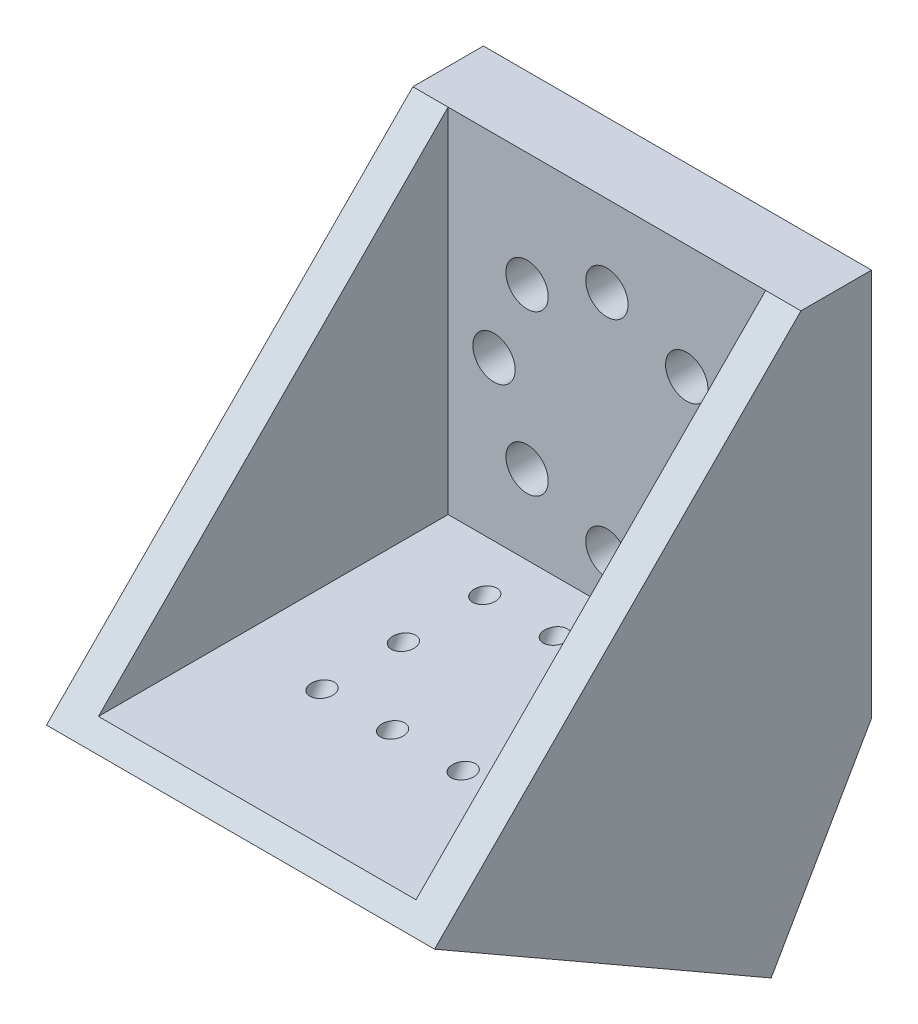
ISO-10303-21;
HEADER;
FILE_DESCRIPTION(('STEP AP214'),'2;1');
FILE_NAME('part.step','',(''),(''),'','','');
FILE_SCHEMA(('AUTOMOTIVE_DESIGN { 1 0 10303 214 1 1 1 1 }'));
ENDSEC;
DATA;
#1=APPLICATION_CONTEXT('core data for automotive mechanical design processes');
#2=APPLICATION_PROTOCOL_DEFINITION('international standard','automotive_design',2000,#1);
#3=PRODUCT_CONTEXT('',#1,'mechanical');
#4=PRODUCT('Part','Part','',(#3));
#5=PRODUCT_RELATED_PRODUCT_CATEGORY('part','',(#4));
#6=PRODUCT_DEFINITION_FORMATION('','',#4);
#7=PRODUCT_DEFINITION_CONTEXT('part definition',#1,'design');
#8=PRODUCT_DEFINITION('design','',#6,#7);
#9=PRODUCT_DEFINITION_SHAPE('','',#8);
#10=(LENGTH_UNIT() NAMED_UNIT(*) SI_UNIT(.MILLI.,.METRE.));
#11=(NAMED_UNIT(*) PLANE_ANGLE_UNIT() SI_UNIT($,.RADIAN.));
#12=(NAMED_UNIT(*) SI_UNIT($,.STERADIAN.) SOLID_ANGLE_UNIT());
#13=UNCERTAINTY_MEASURE_WITH_UNIT(LENGTH_MEASURE(1.E-05),#10,'distance_accuracy_value','');
#14=(GEOMETRIC_REPRESENTATION_CONTEXT(3) GLOBAL_UNCERTAINTY_ASSIGNED_CONTEXT((#13)) GLOBAL_UNIT_ASSIGNED_CONTEXT((#10,
#11,#12)) REPRESENTATION_CONTEXT('',''));
#15=CARTESIAN_POINT('',(0.,0.,0.));
#16=DIRECTION('',(0.,0.,1.));
#17=DIRECTION('',(1.,0.,0.));
#18=AXIS2_PLACEMENT_3D('',#15,#16,#17);
#19=CARTESIAN_POINT('',(-27.5,-27.5,10.));
#20=DIRECTION('',(1.,0.,0.));
#21=DIRECTION('',(0.,0.,-1.));
#22=AXIS2_PLACEMENT_3D('',#19,#20,#21);
#23=PLANE('',#22);
#24=DIRECTION('',(0.,-1.,0.));
#25=VECTOR('',#24,1.);
#26=CARTESIAN_POINT('',(-27.5,-27.5,0.));
#27=LINE('',#26,#25);
#28=CARTESIAN_POINT('',(-27.5,27.5,0.));
#29=VERTEX_POINT('',#28);
#30=CARTESIAN_POINT('',(-27.5,-27.5,0.));
#31=VERTEX_POINT('',#30);
#32=EDGE_CURVE('E89',#29,#31,#27,.T.);
#33=ORIENTED_EDGE('',*,*,#32,.T.);
#34=DIRECTION('',(0.,0.867244547743442,-0.497882410222808));
#35=VECTOR('',#34,1.);
#36=CARTESIAN_POINT('',(-27.5,-27.5,0.));
#37=LINE('',#36,#35);
#38=CARTESIAN_POINT('',(-27.5,-52.2691450902398,14.2198895210988));
#39=VERTEX_POINT('',#38);
#40=EDGE_CURVE('E176',#39,#31,#37,.T.);
#41=ORIENTED_EDGE('',*,*,#40,.F.);
#42=DIRECTION('',(0.,-0.497882410222808,-0.867244547743442));
#43=VECTOR('',#42,1.);
#44=CARTESIAN_POINT('',(-27.5,-52.2691450902398,14.2198895210988));
#45=LINE('',#44,#43);
#46=CARTESIAN_POINT('',(-27.5,-24.8856125279853,61.9183396469881));
#47=VERTEX_POINT('',#46);
#48=EDGE_CURVE('E172',#47,#39,#45,.T.);
#49=ORIENTED_EDGE('',*,*,#48,.F.);
#50=DIRECTION('',(0.,-0.71026743236998,0.703931938836813));
#51=VECTOR('',#50,1.);
#52=CARTESIAN_POINT('',(-27.5,-24.8856125279853,61.9183396469881));
#53=LINE('',#52,#51);
#54=CARTESIAN_POINT('',(-27.5,27.5,10.));
#55=VERTEX_POINT('',#54);
#56=EDGE_CURVE('E92',#55,#47,#53,.T.);
#57=ORIENTED_EDGE('',*,*,#56,.F.);
#58=DIRECTION('',(0.,0.,-1.));
#59=VECTOR('',#58,1.);
#60=CARTESIAN_POINT('',(-27.5,27.5,10.));
#61=LINE('',#60,#59);
#62=EDGE_CURVE('E77',#55,#29,#61,.T.);
#63=ORIENTED_EDGE('',*,*,#62,.T.);
#64=EDGE_LOOP('',(#33,#41,#49,#57,#63));
#65=FACE_BOUND('',#64,.T.);
#66=ADVANCED_FACE('F33',(#65),#23,.F.);
#67=CARTESIAN_POINT('',(27.5,-27.5,10.));
#68=DIRECTION('',(-1.,0.,0.));
#69=DIRECTION('',(0.,0.,1.));
#70=AXIS2_PLACEMENT_3D('',#67,#68,#69);
#71=PLANE('',#70);
#72=DIRECTION('',(0.,0.867244547743442,-0.497882410222808));
#73=VECTOR('',#72,1.);
#74=CARTESIAN_POINT('',(27.5,-27.5,0.));
#75=LINE('',#74,#73);
#76=CARTESIAN_POINT('',(27.5,-52.2691450902398,14.2198895210988));
#77=VERTEX_POINT('',#76);
#78=CARTESIAN_POINT('',(27.5,-27.5,0.));
#79=VERTEX_POINT('',#78);
#80=EDGE_CURVE('E173',#77,#79,#75,.T.);
#81=ORIENTED_EDGE('',*,*,#80,.T.);
#82=DIRECTION('',(0.,1.,0.));
#83=VECTOR('',#82,1.);
#84=CARTESIAN_POINT('',(27.5,-27.5,0.));
#85=LINE('',#84,#83);
#86=CARTESIAN_POINT('',(27.5,27.5,0.));
#87=VERTEX_POINT('',#86);
#88=EDGE_CURVE('E84',#79,#87,#85,.T.);
#89=ORIENTED_EDGE('',*,*,#88,.T.);
#90=DIRECTION('',(0.,0.,-1.));
#91=VECTOR('',#90,1.);
#92=CARTESIAN_POINT('',(27.5,27.5,10.));
#93=LINE('',#92,#91);
#94=CARTESIAN_POINT('',(27.5,27.5,10.));
#95=VERTEX_POINT('',#94);
#96=EDGE_CURVE('E80',#95,#87,#93,.T.);
#97=ORIENTED_EDGE('',*,*,#96,.F.);
#98=DIRECTION('',(0.,-0.71026743236998,0.703931938836813));
#99=VECTOR('',#98,1.);
#100=CARTESIAN_POINT('',(27.5,-24.8856125279853,61.9183396469881));
#101=LINE('',#100,#99);
#102=CARTESIAN_POINT('',(27.5,-24.8856125279853,61.9183396469881));
#103=VERTEX_POINT('',#102);
#104=EDGE_CURVE('E168',#95,#103,#101,.T.);
#105=ORIENTED_EDGE('',*,*,#104,.T.);
#106=DIRECTION('',(0.,-0.497882410222808,-0.867244547743442));
#107=VECTOR('',#106,1.);
#108=CARTESIAN_POINT('',(27.5,-52.2691450902398,14.2198895210988));
#109=LINE('',#108,#107);
#110=EDGE_CURVE('E180',#103,#77,#109,.T.);
#111=ORIENTED_EDGE('',*,*,#110,.T.);
#112=EDGE_LOOP('',(#81,#89,#97,#105,#111));
#113=FACE_BOUND('',#112,.T.);
#114=ADVANCED_FACE('F201',(#113),#71,.F.);
#115=CARTESIAN_POINT('',(27.5,27.5,10.));
#116=DIRECTION('',(0.,-1.,0.));
#117=DIRECTION('',(1.,0.,0.));
#118=AXIS2_PLACEMENT_3D('',#115,#116,#117);
#119=PLANE('',#118);
#120=DIRECTION('',(-1.,0.,0.));
#121=VECTOR('',#120,1.);
#122=CARTESIAN_POINT('',(27.5,27.5,0.));
#123=LINE('',#122,#121);
#124=EDGE_CURVE('E74',#87,#29,#123,.T.);
#125=ORIENTED_EDGE('',*,*,#124,.T.);
#126=ORIENTED_EDGE('',*,*,#62,.F.);
#127=DIRECTION('',(-1.,0.,0.));
#128=VECTOR('',#127,1.);
#129=CARTESIAN_POINT('',(27.5,27.5,10.));
#130=LINE('',#129,#128);
#131=CARTESIAN_POINT('',(-22.5,27.5,10.));
#132=VERTEX_POINT('',#131);
#133=EDGE_CURVE('E57',#132,#55,#130,.T.);
#134=ORIENTED_EDGE('',*,*,#133,.F.);
#135=CARTESIAN_POINT('',(22.5,27.5,10.));
#136=VERTEX_POINT('',#135);
#137=EDGE_CURVE('E203',#136,#132,#130,.T.);
#138=ORIENTED_EDGE('',*,*,#137,.F.);
#139=EDGE_CURVE('E93',#95,#136,#130,.T.);
#140=ORIENTED_EDGE('',*,*,#139,.F.);
#141=ORIENTED_EDGE('',*,*,#96,.T.);
#142=EDGE_LOOP('',(#125,#126,#134,#138,#140,#141));
#143=FACE_BOUND('',#142,.T.);
#144=ADVANCED_FACE('F76',(#143),#119,.F.);
#145=CARTESIAN_POINT('',(0.,0.,0.));
#146=DIRECTION('',(0.,0.,1.));
#147=DIRECTION('',(1.,0.,0.));
#148=AXIS2_PLACEMENT_3D('',#145,#146,#147);
#149=PLANE('',#148);
#150=CARTESIAN_POINT('',(-11.3137084989849,11.3137084989846,0.));
#151=DIRECTION('',(0.,0.,-1.));
#152=DIRECTION('',(-1.,0.,0.));
#153=AXIS2_PLACEMENT_3D('',#150,#151,#152);
#154=CIRCLE('',#153,3.);
#155=CARTESIAN_POINT('',(-14.3137084989849,11.3137084989846,0.));
#156=VERTEX_POINT('',#155);
#157=EDGE_CURVE('E137',#156,#156,#154,.T.);
#158=ORIENTED_EDGE('',*,*,#157,.F.);
#159=EDGE_LOOP('',(#158));
#160=FACE_BOUND('',#159,.T.);
#161=CARTESIAN_POINT('',(-1.6759110426447E-13,16.,0.));
#162=DIRECTION('',(0.,0.,-1.));
#163=DIRECTION('',(-1.,0.,0.));
#164=AXIS2_PLACEMENT_3D('',#161,#162,#163);
#165=CIRCLE('',#164,3.);
#166=CARTESIAN_POINT('',(-3.00000000000017,16.,0.));
#167=VERTEX_POINT('',#166);
#168=EDGE_CURVE('E146',#167,#167,#165,.T.);
#169=ORIENTED_EDGE('',*,*,#168,.F.);
#170=EDGE_LOOP('',(#169));
#171=FACE_BOUND('',#170,.T.);
#172=CARTESIAN_POINT('',(11.3137084989847,11.3137084989849,0.));
#173=DIRECTION('',(0.,0.,-1.));
#174=DIRECTION('',(-1.,0.,0.));
#175=AXIS2_PLACEMENT_3D('',#172,#173,#174);
#176=CIRCLE('',#175,3.);
#177=CARTESIAN_POINT('',(8.31370849898466,11.3137084989849,0.));
#178=VERTEX_POINT('',#177);
#179=EDGE_CURVE('E492',#178,#178,#176,.T.);
#180=ORIENTED_EDGE('',*,*,#179,.F.);
#181=EDGE_LOOP('',(#180));
#182=FACE_BOUND('',#181,.T.);
#183=CARTESIAN_POINT('',(16.,1.1172740284298E-13,0.));
#184=DIRECTION('',(0.,0.,-1.));
#185=DIRECTION('',(-1.,0.,0.));
#186=AXIS2_PLACEMENT_3D('',#183,#184,#185);
#187=CIRCLE('',#186,3.);
#188=CARTESIAN_POINT('',(13.,1.1172740284298E-13,0.));
#189=VERTEX_POINT('',#188);
#190=EDGE_CURVE('E486',#189,#189,#187,.T.);
#191=ORIENTED_EDGE('',*,*,#190,.F.);
#192=EDGE_LOOP('',(#191));
#193=FACE_BOUND('',#192,.T.);
#194=CARTESIAN_POINT('',(11.3137084989848,-11.3137084989847,0.));
#195=DIRECTION('',(0.,0.,-1.));
#196=DIRECTION('',(-1.,0.,0.));
#197=AXIS2_PLACEMENT_3D('',#194,#195,#196);
#198=CIRCLE('',#197,3.);
#199=CARTESIAN_POINT('',(8.31370849898482,-11.3137084989847,0.));
#200=VERTEX_POINT('',#199);
#201=EDGE_CURVE('E480',#200,#200,#198,.T.);
#202=ORIENTED_EDGE('',*,*,#201,.F.);
#203=EDGE_LOOP('',(#202));
#204=FACE_BOUND('',#203,.T.);
#205=CARTESIAN_POINT('',(0.,-16.,0.));
#206=DIRECTION('',(0.,0.,-1.));
#207=DIRECTION('',(-1.,0.,0.));
#208=AXIS2_PLACEMENT_3D('',#205,#206,#207);
#209=CIRCLE('',#208,3.);
#210=CARTESIAN_POINT('',(-2.99999999999995,-16.,0.));
#211=VERTEX_POINT('',#210);
#212=EDGE_CURVE('E474',#211,#211,#209,.T.);
#213=ORIENTED_EDGE('',*,*,#212,.F.);
#214=EDGE_LOOP('',(#213));
#215=FACE_BOUND('',#214,.T.);
#216=CARTESIAN_POINT('',(-11.3137084989847,-11.3137084989848,0.));
#217=DIRECTION('',(0.,0.,-1.));
#218=DIRECTION('',(-1.,0.,0.));
#219=AXIS2_PLACEMENT_3D('',#216,#217,#218);
#220=CIRCLE('',#219,3.);
#221=CARTESIAN_POINT('',(-14.3137084989847,-11.3137084989848,0.));
#222=VERTEX_POINT('',#221);
#223=EDGE_CURVE('E468',#222,#222,#220,.T.);
#224=ORIENTED_EDGE('',*,*,#223,.F.);
#225=EDGE_LOOP('',(#224));
#226=FACE_BOUND('',#225,.T.);
#227=CARTESIAN_POINT('',(-16.,0.,0.));
#228=DIRECTION('',(0.,0.,-1.));
#229=DIRECTION('',(-1.,0.,0.));
#230=AXIS2_PLACEMENT_3D('',#227,#228,#229);
#231=CIRCLE('',#230,3.);
#232=CARTESIAN_POINT('',(-19.,0.,0.));
#233=VERTEX_POINT('',#232);
#234=EDGE_CURVE('E154',#233,#233,#231,.T.);
#235=ORIENTED_EDGE('',*,*,#234,.F.);
#236=EDGE_LOOP('',(#235));
#237=FACE_BOUND('',#236,.T.);
#238=ORIENTED_EDGE('',*,*,#32,.F.);
#239=ORIENTED_EDGE('',*,*,#124,.F.);
#240=ORIENTED_EDGE('',*,*,#88,.F.);
#241=DIRECTION('',(1.,0.,0.));
#242=VECTOR('',#241,1.);
#243=CARTESIAN_POINT('',(27.5,-27.5,0.));
#244=LINE('',#243,#242);
#245=EDGE_CURVE('E97',#31,#79,#244,.T.);
#246=ORIENTED_EDGE('',*,*,#245,.F.);
#247=EDGE_LOOP('',(#238,#239,#240,#246));
#248=FACE_BOUND('',#247,.T.);
#249=ADVANCED_FACE('F95',(#160,#171,#182,#193,#204,#215,#226,#237,#248),#149,.F.);
#250=CARTESIAN_POINT('',(-27.5,-27.5,0.));
#251=DIRECTION('',(0.,-0.497882410222808,-0.867244547743442));
#252=DIRECTION('',(0.,0.867244547743442,-0.497882410222808));
#253=AXIS2_PLACEMENT_3D('',#250,#251,#252);
#254=PLANE('',#253);
#255=ORIENTED_EDGE('',*,*,#80,.F.);
#256=DIRECTION('',(1.,0.,0.));
#257=VECTOR('',#256,1.);
#258=CARTESIAN_POINT('',(-27.5,-52.2691450902398,14.2198895210988));
#259=LINE('',#258,#257);
#260=EDGE_CURVE('E98',#39,#77,#259,.T.);
#261=ORIENTED_EDGE('',*,*,#260,.F.);
#262=ORIENTED_EDGE('',*,*,#40,.T.);
#263=ORIENTED_EDGE('',*,*,#245,.T.);
#264=EDGE_LOOP('',(#255,#261,#262,#263));
#265=FACE_BOUND('',#264,.T.);
#266=ADVANCED_FACE('F229',(#265),#254,.T.);
#267=CARTESIAN_POINT('',(-27.5,-52.2691450902398,14.2198895210988));
#268=DIRECTION('',(0.,-0.867244547743442,0.497882410222808));
#269=DIRECTION('',(0.,-0.497882410222808,-0.867244547743442));
#270=AXIS2_PLACEMENT_3D('',#267,#268,#269);
#271=PLANE('',#270);
#272=CARTESIAN_POINT('',(10.,-38.5773788091126,38.0691145840435));
#273=DIRECTION('',(0.,-0.867244547743442,0.497882410222808));
#274=DIRECTION('',(0.,-0.497882410222808,-0.867244547743442));
#275=AXIS2_PLACEMENT_3D('',#272,#273,#274);
#276=CIRCLE('',#275,1.49999999999999);
#277=CARTESIAN_POINT('',(10.,-39.3242024244468,36.7682477624283));
#278=VERTEX_POINT('',#277);
#279=EDGE_CURVE('E449',#278,#278,#276,.T.);
#280=ORIENTED_EDGE('',*,*,#279,.F.);
#281=EDGE_LOOP('',(#280));
#282=FACE_BOUND('',#281,.T.);
#283=CARTESIAN_POINT('',(0.,-33.5985547068845,46.7415600614779));
#284=DIRECTION('',(0.,-0.867244547743442,0.497882410222808));
#285=DIRECTION('',(0.,-0.497882410222808,-0.867244547743442));
#286=AXIS2_PLACEMENT_3D('',#283,#284,#285);
#287=CIRCLE('',#286,1.5);
#288=CARTESIAN_POINT('',(0.,-34.3453783222187,45.4406932398627));
#289=VERTEX_POINT('',#288);
#290=EDGE_CURVE('E450',#289,#289,#287,.T.);
#291=ORIENTED_EDGE('',*,*,#290,.F.);
#292=EDGE_LOOP('',(#291));
#293=FACE_BOUND('',#292,.T.);
#294=CARTESIAN_POINT('',(-10.,-38.5773788091126,38.0691145840434));
#295=DIRECTION('',(0.,-0.867244547743442,0.497882410222808));
#296=DIRECTION('',(0.,0.497882410222808,0.867244547743442));
#297=AXIS2_PLACEMENT_3D('',#294,#295,#296);
#298=CIRCLE('',#297,1.5);
#299=CARTESIAN_POINT('',(-10.,-37.8305551937784,39.3699814056586));
#300=VERTEX_POINT('',#299);
#301=EDGE_CURVE('E460',#300,#300,#298,.T.);
#302=ORIENTED_EDGE('',*,*,#301,.F.);
#303=EDGE_LOOP('',(#302));
#304=FACE_BOUND('',#303,.T.);
#305=CARTESIAN_POINT('',(-10.,-33.5985547068845,46.7415600614779));
#306=DIRECTION('',(0.,-0.867244547743442,0.497882410222808));
#307=DIRECTION('',(0.,0.497882410222808,0.867244547743442));
#308=AXIS2_PLACEMENT_3D('',#305,#306,#307);
#309=CIRCLE('',#308,1.5);
#310=CARTESIAN_POINT('',(-10.,-32.8517310915503,48.042426883093));
#311=VERTEX_POINT('',#310);
#312=EDGE_CURVE('E454',#311,#311,#309,.T.);
#313=ORIENTED_EDGE('',*,*,#312,.F.);
#314=EDGE_LOOP('',(#313));
#315=FACE_BOUND('',#314,.T.);
#316=CARTESIAN_POINT('',(-10.,-43.5562029113407,29.396669106609));
#317=DIRECTION('',(0.,-0.867244547743442,0.497882410222808));
#318=DIRECTION('',(0.,-0.497882410222808,-0.867244547743442));
#319=AXIS2_PLACEMENT_3D('',#316,#317,#318);
#320=CIRCLE('',#319,1.5);
#321=CARTESIAN_POINT('',(-10.,-44.3030265266749,28.0958022849939));
#322=VERTEX_POINT('',#321);
#323=EDGE_CURVE('E463',#322,#322,#320,.T.);
#324=ORIENTED_EDGE('',*,*,#323,.F.);
#325=EDGE_LOOP('',(#324));
#326=FACE_BOUND('',#325,.T.);
#327=CARTESIAN_POINT('',(0.,-43.5562029113407,29.396669106609));
#328=DIRECTION('',(0.,-0.867244547743442,0.497882410222808));
#329=DIRECTION('',(0.,0.497882410222808,0.867244547743442));
#330=AXIS2_PLACEMENT_3D('',#327,#328,#329);
#331=CIRCLE('',#330,1.5);
#332=CARTESIAN_POINT('',(0.,-42.8093792960064,30.6975359282242));
#333=VERTEX_POINT('',#332);
#334=EDGE_CURVE('E538',#333,#333,#331,.T.);
#335=ORIENTED_EDGE('',*,*,#334,.F.);
#336=EDGE_LOOP('',(#335));
#337=FACE_BOUND('',#336,.T.);
#338=CARTESIAN_POINT('',(10.,-43.5562029113407,29.396669106609));
#339=DIRECTION('',(0.,-0.867244547743442,0.497882410222808));
#340=DIRECTION('',(0.,0.497882410222808,0.867244547743442));
#341=AXIS2_PLACEMENT_3D('',#338,#339,#340);
#342=CIRCLE('',#341,1.5);
#343=CARTESIAN_POINT('',(10.,-42.8093792960064,30.6975359282242));
#344=VERTEX_POINT('',#343);
#345=EDGE_CURVE('E457',#344,#344,#342,.T.);
#346=ORIENTED_EDGE('',*,*,#345,.F.);
#347=EDGE_LOOP('',(#346));
#348=FACE_BOUND('',#347,.T.);
#349=CARTESIAN_POINT('',(10.,-33.5985547068845,46.7415600614779));
#350=DIRECTION('',(0.,-0.867244547743442,0.497882410222808));
#351=DIRECTION('',(0.,-0.497882410222808,-0.867244547743442));
#352=AXIS2_PLACEMENT_3D('',#349,#350,#351);
#353=CIRCLE('',#352,1.5);
#354=CARTESIAN_POINT('',(10.,-34.3453783222187,45.4406932398627));
#355=VERTEX_POINT('',#354);
#356=EDGE_CURVE('E118',#355,#355,#353,.T.);
#357=ORIENTED_EDGE('',*,*,#356,.F.);
#358=EDGE_LOOP('',(#357));
#359=FACE_BOUND('',#358,.T.);
#360=ORIENTED_EDGE('',*,*,#110,.F.);
#361=DIRECTION('',(1.,0.,0.));
#362=VECTOR('',#361,1.);
#363=CARTESIAN_POINT('',(-27.5,-24.8856125279853,61.9183396469881));
#364=LINE('',#363,#362);
#365=EDGE_CURVE('E102',#47,#103,#364,.T.);
#366=ORIENTED_EDGE('',*,*,#365,.F.);
#367=ORIENTED_EDGE('',*,*,#48,.T.);
#368=ORIENTED_EDGE('',*,*,#260,.T.);
#369=EDGE_LOOP('',(#360,#366,#367,#368));
#370=FACE_BOUND('',#369,.T.);
#371=ADVANCED_FACE('F197',(#282,#293,#304,#315,#326,#337,#348,#359,#370),#271,.T.);
#372=CARTESIAN_POINT('',(-27.5,-24.8856125279853,61.9183396469881));
#373=DIRECTION('',(0.,0.703931938836813,0.71026743236998));
#374=DIRECTION('',(0.,-0.71026743236998,0.703931938836813));
#375=AXIS2_PLACEMENT_3D('',#372,#373,#374);
#376=PLANE('',#375);
#377=DIRECTION('',(0.,0.71026743236998,-0.703931938836813));
#378=VECTOR('',#377,1.);
#379=CARTESIAN_POINT('',(22.5,-24.8856125279853,61.9183396469881));
#380=LINE('',#379,#378);
#381=CARTESIAN_POINT('',(22.5,-22.5,59.5540064738695));
#382=VERTEX_POINT('',#381);
#383=EDGE_CURVE('E11',#382,#136,#380,.T.);
#384=ORIENTED_EDGE('',*,*,#383,.F.);
#385=DIRECTION('',(1.,0.,0.));
#386=VECTOR('',#385,1.);
#387=CARTESIAN_POINT('',(-27.5,-22.5,59.5540064738695));
#388=LINE('',#387,#386);
#389=CARTESIAN_POINT('',(-22.5,-22.5,59.5540064738695));
#390=VERTEX_POINT('',#389);
#391=EDGE_CURVE('E109',#390,#382,#388,.T.);
#392=ORIENTED_EDGE('',*,*,#391,.F.);
#393=DIRECTION('',(0.,-0.71026743236998,0.703931938836813));
#394=VECTOR('',#393,1.);
#395=CARTESIAN_POINT('',(-22.5,-24.8856125279853,61.9183396469881));
#396=LINE('',#395,#394);
#397=EDGE_CURVE('E41',#132,#390,#396,.T.);
#398=ORIENTED_EDGE('',*,*,#397,.F.);
#399=ORIENTED_EDGE('',*,*,#133,.T.);
#400=ORIENTED_EDGE('',*,*,#56,.T.);
#401=ORIENTED_EDGE('',*,*,#365,.T.);
#402=ORIENTED_EDGE('',*,*,#104,.F.);
#403=ORIENTED_EDGE('',*,*,#139,.T.);
#404=EDGE_LOOP('',(#384,#392,#398,#399,#400,#401,#402,#403));
#405=FACE_BOUND('',#404,.T.);
#406=ADVANCED_FACE('F190',(#405),#376,.T.);
#407=CARTESIAN_POINT('',(22.5,22.5,60.));
#408=DIRECTION('',(1.,0.,0.));
#409=DIRECTION('',(0.,0.,-1.));
#410=AXIS2_PLACEMENT_3D('',#407,#408,#409);
#411=PLANE('',#410);
#412=ORIENTED_EDGE('',*,*,#383,.T.);
#413=DIRECTION('',(0.,-1.,0.));
#414=VECTOR('',#413,1.);
#415=CARTESIAN_POINT('',(22.5,22.5,10.));
#416=LINE('',#415,#414);
#417=CARTESIAN_POINT('',(22.5,-22.5,10.));
#418=VERTEX_POINT('',#417);
#419=EDGE_CURVE('E49',#136,#418,#416,.T.);
#420=ORIENTED_EDGE('',*,*,#419,.T.);
#421=DIRECTION('',(0.,0.,-1.));
#422=VECTOR('',#421,1.);
#423=CARTESIAN_POINT('',(22.5,-22.5,60.));
#424=LINE('',#423,#422);
#425=EDGE_CURVE('E164',#382,#418,#424,.T.);
#426=ORIENTED_EDGE('',*,*,#425,.F.);
#427=EDGE_LOOP('',(#412,#420,#426));
#428=FACE_BOUND('',#427,.T.);
#429=ADVANCED_FACE('F221',(#428),#411,.F.);
#430=CARTESIAN_POINT('',(-22.5,22.5,60.));
#431=DIRECTION('',(-1.,0.,0.));
#432=DIRECTION('',(0.,0.,1.));
#433=AXIS2_PLACEMENT_3D('',#430,#431,#432);
#434=PLANE('',#433);
#435=ORIENTED_EDGE('',*,*,#397,.T.);
#436=DIRECTION('',(0.,0.,-1.));
#437=VECTOR('',#436,1.);
#438=CARTESIAN_POINT('',(-22.5,-22.5,60.));
#439=LINE('',#438,#437);
#440=CARTESIAN_POINT('',(-22.5,-22.5,10.));
#441=VERTEX_POINT('',#440);
#442=EDGE_CURVE('E165',#390,#441,#439,.T.);
#443=ORIENTED_EDGE('',*,*,#442,.T.);
#444=DIRECTION('',(0.,1.,0.));
#445=VECTOR('',#444,1.);
#446=CARTESIAN_POINT('',(-22.5,22.5,10.));
#447=LINE('',#446,#445);
#448=EDGE_CURVE('E160',#441,#132,#447,.T.);
#449=ORIENTED_EDGE('',*,*,#448,.T.);
#450=EDGE_LOOP('',(#435,#443,#449));
#451=FACE_BOUND('',#450,.T.);
#452=ADVANCED_FACE('F211',(#451),#434,.F.);
#453=CARTESIAN_POINT('',(-22.5,-22.5,60.));
#454=DIRECTION('',(0.,-1.,0.));
#455=DIRECTION('',(1.,0.,0.));
#456=AXIS2_PLACEMENT_3D('',#453,#454,#455);
#457=PLANE('',#456);
#458=CARTESIAN_POINT('',(10.,-22.5,28.8391411787634));
#459=DIRECTION('',(0.,-1.,0.));
#460=DIRECTION('',(0.,0.,1.));
#461=AXIS2_PLACEMENT_3D('',#458,#459,#460);
#462=ELLIPSE('',#461,1.7296159473161,1.49999999999999);
#463=CARTESIAN_POINT('',(10.,-22.5,30.5687571260795));
#464=VERTEX_POINT('',#463);
#465=EDGE_CURVE('E36',#464,#464,#462,.T.);
#466=ORIENTED_EDGE('',*,*,#465,.T.);
#467=EDGE_LOOP('',(#466));
#468=FACE_BOUND('',#467,.T.);
#469=CARTESIAN_POINT('',(0.,-22.5,40.3699141608708));
#470=DIRECTION('',(0.,-1.,0.));
#471=DIRECTION('',(0.,0.,1.));
#472=AXIS2_PLACEMENT_3D('',#469,#470,#471);
#473=ELLIPSE('',#472,1.72961594731611,1.5);
#474=CARTESIAN_POINT('',(0.,-22.5,42.0995301081869));
#475=VERTEX_POINT('',#474);
#476=EDGE_CURVE('E132',#475,#475,#473,.T.);
#477=ORIENTED_EDGE('',*,*,#476,.T.);
#478=EDGE_LOOP('',(#477));
#479=FACE_BOUND('',#478,.T.);
#480=CARTESIAN_POINT('',(-10.,-22.5,28.8391411787634));
#481=DIRECTION('',(0.,-1.,0.));
#482=DIRECTION('',(0.,0.,1.));
#483=AXIS2_PLACEMENT_3D('',#480,#481,#482);
#484=ELLIPSE('',#483,1.7296159473161,1.5);
#485=CARTESIAN_POINT('',(-10.,-22.5,30.5687571260795));
#486=VERTEX_POINT('',#485);
#487=EDGE_CURVE('E130',#486,#486,#484,.T.);
#488=ORIENTED_EDGE('',*,*,#487,.T.);
#489=EDGE_LOOP('',(#488));
#490=FACE_BOUND('',#489,.T.);
#491=CARTESIAN_POINT('',(-10.,-22.5,40.3699141608708));
#492=DIRECTION('',(0.,-1.,0.));
#493=DIRECTION('',(0.,0.,1.));
#494=AXIS2_PLACEMENT_3D('',#491,#492,#493);
#495=ELLIPSE('',#494,1.72961594731611,1.5);
#496=CARTESIAN_POINT('',(-10.,-22.5,42.0995301081869));
#497=VERTEX_POINT('',#496);
#498=EDGE_CURVE('E127',#497,#497,#495,.T.);
#499=ORIENTED_EDGE('',*,*,#498,.T.);
#500=EDGE_LOOP('',(#499));
#501=FACE_BOUND('',#500,.T.);
#502=CARTESIAN_POINT('',(-10.,-22.5,17.308368196656));
#503=DIRECTION('',(0.,-1.,0.));
#504=DIRECTION('',(0.,0.,1.));
#505=AXIS2_PLACEMENT_3D('',#502,#503,#504);
#506=ELLIPSE('',#505,1.72961594731611,1.5);
#507=CARTESIAN_POINT('',(-10.,-22.5,19.0379841439722));
#508=VERTEX_POINT('',#507);
#509=EDGE_CURVE('E124',#508,#508,#506,.T.);
#510=ORIENTED_EDGE('',*,*,#509,.T.);
#511=EDGE_LOOP('',(#510));
#512=FACE_BOUND('',#511,.T.);
#513=CARTESIAN_POINT('',(0.,-22.5,17.3083681966561));
#514=DIRECTION('',(0.,-1.,0.));
#515=DIRECTION('',(0.,0.,1.));
#516=AXIS2_PLACEMENT_3D('',#513,#514,#515);
#517=ELLIPSE('',#516,1.72961594731611,1.5);
#518=CARTESIAN_POINT('',(0.,-22.5,19.0379841439722));
#519=VERTEX_POINT('',#518);
#520=EDGE_CURVE('E121',#519,#519,#517,.T.);
#521=ORIENTED_EDGE('',*,*,#520,.T.);
#522=EDGE_LOOP('',(#521));
#523=FACE_BOUND('',#522,.T.);
#524=CARTESIAN_POINT('',(10.,-22.5,17.3083681966561));
#525=DIRECTION('',(0.,-1.,0.));
#526=DIRECTION('',(0.,0.,1.));
#527=AXIS2_PLACEMENT_3D('',#524,#525,#526);
#528=ELLIPSE('',#527,1.72961594731611,1.5);
#529=CARTESIAN_POINT('',(10.,-22.5,19.0379841439722));
#530=VERTEX_POINT('',#529);
#531=EDGE_CURVE('E117',#530,#530,#528,.T.);
#532=ORIENTED_EDGE('',*,*,#531,.T.);
#533=EDGE_LOOP('',(#532));
#534=FACE_BOUND('',#533,.T.);
#535=CARTESIAN_POINT('',(10.,-22.5,40.3699141608708));
#536=DIRECTION('',(0.,-1.,0.));
#537=DIRECTION('',(0.,0.,1.));
#538=AXIS2_PLACEMENT_3D('',#535,#536,#537);
#539=ELLIPSE('',#538,1.72961594731611,1.5);
#540=CARTESIAN_POINT('',(10.,-22.5,42.0995301081869));
#541=VERTEX_POINT('',#540);
#542=EDGE_CURVE('E114',#541,#541,#539,.T.);
#543=ORIENTED_EDGE('',*,*,#542,.T.);
#544=EDGE_LOOP('',(#543));
#545=FACE_BOUND('',#544,.T.);
#546=ORIENTED_EDGE('',*,*,#391,.T.);
#547=ORIENTED_EDGE('',*,*,#425,.T.);
#548=DIRECTION('',(-1.,0.,0.));
#549=VECTOR('',#548,1.);
#550=CARTESIAN_POINT('',(-22.5,-22.5,10.));
#551=LINE('',#550,#549);
#552=EDGE_CURVE('E153',#418,#441,#551,.T.);
#553=ORIENTED_EDGE('',*,*,#552,.T.);
#554=ORIENTED_EDGE('',*,*,#442,.F.);
#555=EDGE_LOOP('',(#546,#547,#553,#554));
#556=FACE_BOUND('',#555,.T.);
#557=ADVANCED_FACE('F217',(#468,#479,#490,#501,#512,#523,#534,#545,#556),#457,.F.);
#558=CARTESIAN_POINT('',(0.,0.,10.));
#559=DIRECTION('',(0.,0.,1.));
#560=DIRECTION('',(1.,0.,0.));
#561=AXIS2_PLACEMENT_3D('',#558,#559,#560);
#562=PLANE('',#561);
#563=CARTESIAN_POINT('',(-11.3137084989849,11.3137084989846,10.));
#564=DIRECTION('',(0.,0.,-1.));
#565=DIRECTION('',(-1.,0.,0.));
#566=AXIS2_PLACEMENT_3D('',#563,#564,#565);
#567=CIRCLE('',#566,3.);
#568=CARTESIAN_POINT('',(-14.3137084989849,11.3137084989846,10.));
#569=VERTEX_POINT('',#568);
#570=EDGE_CURVE('E141',#569,#569,#567,.T.);
#571=ORIENTED_EDGE('',*,*,#570,.T.);
#572=EDGE_LOOP('',(#571));
#573=FACE_BOUND('',#572,.T.);
#574=CARTESIAN_POINT('',(-1.6759110426447E-13,16.,10.));
#575=DIRECTION('',(0.,0.,-1.));
#576=DIRECTION('',(-1.,0.,0.));
#577=AXIS2_PLACEMENT_3D('',#574,#575,#576);
#578=CIRCLE('',#577,3.);
#579=CARTESIAN_POINT('',(-3.00000000000017,16.,10.));
#580=VERTEX_POINT('',#579);
#581=EDGE_CURVE('E495',#580,#580,#578,.T.);
#582=ORIENTED_EDGE('',*,*,#581,.T.);
#583=EDGE_LOOP('',(#582));
#584=FACE_BOUND('',#583,.T.);
#585=CARTESIAN_POINT('',(11.3137084989847,11.3137084989849,10.));
#586=DIRECTION('',(0.,0.,-1.));
#587=DIRECTION('',(-1.,0.,0.));
#588=AXIS2_PLACEMENT_3D('',#585,#586,#587);
#589=CIRCLE('',#588,3.);
#590=CARTESIAN_POINT('',(8.31370849898466,11.3137084989849,10.));
#591=VERTEX_POINT('',#590);
#592=EDGE_CURVE('E489',#591,#591,#589,.T.);
#593=ORIENTED_EDGE('',*,*,#592,.T.);
#594=EDGE_LOOP('',(#593));
#595=FACE_BOUND('',#594,.T.);
#596=CARTESIAN_POINT('',(16.,1.1172740284298E-13,10.));
#597=DIRECTION('',(0.,0.,-1.));
#598=DIRECTION('',(-1.,0.,0.));
#599=AXIS2_PLACEMENT_3D('',#596,#597,#598);
#600=CIRCLE('',#599,3.);
#601=CARTESIAN_POINT('',(13.,1.1172740284298E-13,10.));
#602=VERTEX_POINT('',#601);
#603=EDGE_CURVE('E483',#602,#602,#600,.T.);
#604=ORIENTED_EDGE('',*,*,#603,.T.);
#605=EDGE_LOOP('',(#604));
#606=FACE_BOUND('',#605,.T.);
#607=CARTESIAN_POINT('',(11.3137084989848,-11.3137084989847,10.));
#608=DIRECTION('',(0.,0.,-1.));
#609=DIRECTION('',(-1.,0.,0.));
#610=AXIS2_PLACEMENT_3D('',#607,#608,#609);
#611=CIRCLE('',#610,3.);
#612=CARTESIAN_POINT('',(8.31370849898482,-11.3137084989847,10.));
#613=VERTEX_POINT('',#612);
#614=EDGE_CURVE('E477',#613,#613,#611,.T.);
#615=ORIENTED_EDGE('',*,*,#614,.T.);
#616=EDGE_LOOP('',(#615));
#617=FACE_BOUND('',#616,.T.);
#618=CARTESIAN_POINT('',(0.,-16.,10.));
#619=DIRECTION('',(0.,0.,-1.));
#620=DIRECTION('',(-1.,0.,0.));
#621=AXIS2_PLACEMENT_3D('',#618,#619,#620);
#622=CIRCLE('',#621,3.);
#623=CARTESIAN_POINT('',(-2.99999999999995,-16.,10.));
#624=VERTEX_POINT('',#623);
#625=EDGE_CURVE('E471',#624,#624,#622,.T.);
#626=ORIENTED_EDGE('',*,*,#625,.T.);
#627=EDGE_LOOP('',(#626));
#628=FACE_BOUND('',#627,.T.);
#629=CARTESIAN_POINT('',(-11.3137084989847,-11.3137084989848,10.));
#630=DIRECTION('',(0.,0.,-1.));
#631=DIRECTION('',(-1.,0.,0.));
#632=AXIS2_PLACEMENT_3D('',#629,#630,#631);
#633=CIRCLE('',#632,3.);
#634=CARTESIAN_POINT('',(-14.3137084989847,-11.3137084989848,10.));
#635=VERTEX_POINT('',#634);
#636=EDGE_CURVE('E157',#635,#635,#633,.T.);
#637=ORIENTED_EDGE('',*,*,#636,.T.);
#638=EDGE_LOOP('',(#637));
#639=FACE_BOUND('',#638,.T.);
#640=CARTESIAN_POINT('',(-16.,0.,10.));
#641=DIRECTION('',(0.,0.,-1.));
#642=DIRECTION('',(-1.,0.,0.));
#643=AXIS2_PLACEMENT_3D('',#640,#641,#642);
#644=CIRCLE('',#643,3.);
#645=CARTESIAN_POINT('',(-19.,0.,10.));
#646=VERTEX_POINT('',#645);
#647=EDGE_CURVE('E150',#646,#646,#644,.T.);
#648=ORIENTED_EDGE('',*,*,#647,.T.);
#649=EDGE_LOOP('',(#648));
#650=FACE_BOUND('',#649,.T.);
#651=ORIENTED_EDGE('',*,*,#448,.F.);
#652=ORIENTED_EDGE('',*,*,#552,.F.);
#653=ORIENTED_EDGE('',*,*,#419,.F.);
#654=ORIENTED_EDGE('',*,*,#137,.T.);
#655=EDGE_LOOP('',(#651,#652,#653,#654));
#656=FACE_BOUND('',#655,.T.);
#657=ADVANCED_FACE('F206',(#573,#584,#595,#606,#617,#628,#639,#650,#656),#562,.T.);
#658=CARTESIAN_POINT('',(-16.,0.,10.));
#659=DIRECTION('',(0.,0.,-1.));
#660=DIRECTION('',(-1.,0.,0.));
#661=AXIS2_PLACEMENT_3D('',#658,#659,#660);
#662=CYLINDRICAL_SURFACE('',#661,3.);
#663=ORIENTED_EDGE('',*,*,#647,.F.);
#664=EDGE_LOOP('',(#663));
#665=FACE_BOUND('',#664,.T.);
#666=ORIENTED_EDGE('',*,*,#234,.T.);
#667=EDGE_LOOP('',(#666));
#668=FACE_BOUND('',#667,.T.);
#669=ADVANCED_FACE('F265',(#665,#668),#662,.F.);
#670=CARTESIAN_POINT('',(-11.3137084989847,-11.3137084989848,10.));
#671=DIRECTION('',(0.,0.,-1.));
#672=DIRECTION('',(-1.,0.,0.));
#673=AXIS2_PLACEMENT_3D('',#670,#671,#672);
#674=CYLINDRICAL_SURFACE('',#673,3.);
#675=ORIENTED_EDGE('',*,*,#636,.F.);
#676=EDGE_LOOP('',(#675));
#677=FACE_BOUND('',#676,.T.);
#678=ORIENTED_EDGE('',*,*,#223,.T.);
#679=EDGE_LOOP('',(#678));
#680=FACE_BOUND('',#679,.T.);
#681=ADVANCED_FACE('F301',(#677,#680),#674,.F.);
#682=CARTESIAN_POINT('',(0.,-16.,10.));
#683=DIRECTION('',(0.,0.,-1.));
#684=DIRECTION('',(-1.,0.,0.));
#685=AXIS2_PLACEMENT_3D('',#682,#683,#684);
#686=CYLINDRICAL_SURFACE('',#685,3.);
#687=ORIENTED_EDGE('',*,*,#625,.F.);
#688=EDGE_LOOP('',(#687));
#689=FACE_BOUND('',#688,.T.);
#690=ORIENTED_EDGE('',*,*,#212,.T.);
#691=EDGE_LOOP('',(#690));
#692=FACE_BOUND('',#691,.T.);
#693=ADVANCED_FACE('F304',(#689,#692),#686,.F.);
#694=CARTESIAN_POINT('',(11.3137084989848,-11.3137084989847,10.));
#695=DIRECTION('',(0.,0.,-1.));
#696=DIRECTION('',(-1.,0.,0.));
#697=AXIS2_PLACEMENT_3D('',#694,#695,#696);
#698=CYLINDRICAL_SURFACE('',#697,3.);
#699=ORIENTED_EDGE('',*,*,#614,.F.);
#700=EDGE_LOOP('',(#699));
#701=FACE_BOUND('',#700,.T.);
#702=ORIENTED_EDGE('',*,*,#201,.T.);
#703=EDGE_LOOP('',(#702));
#704=FACE_BOUND('',#703,.T.);
#705=ADVANCED_FACE('F308',(#701,#704),#698,.F.);
#706=CARTESIAN_POINT('',(16.,1.1172740284298E-13,10.));
#707=DIRECTION('',(0.,0.,-1.));
#708=DIRECTION('',(-1.,0.,0.));
#709=AXIS2_PLACEMENT_3D('',#706,#707,#708);
#710=CYLINDRICAL_SURFACE('',#709,3.);
#711=ORIENTED_EDGE('',*,*,#603,.F.);
#712=EDGE_LOOP('',(#711));
#713=FACE_BOUND('',#712,.T.);
#714=ORIENTED_EDGE('',*,*,#190,.T.);
#715=EDGE_LOOP('',(#714));
#716=FACE_BOUND('',#715,.T.);
#717=ADVANCED_FACE('F312',(#713,#716),#710,.F.);
#718=CARTESIAN_POINT('',(11.3137084989847,11.3137084989849,10.));
#719=DIRECTION('',(0.,0.,-1.));
#720=DIRECTION('',(-1.,0.,0.));
#721=AXIS2_PLACEMENT_3D('',#718,#719,#720);
#722=CYLINDRICAL_SURFACE('',#721,3.);
#723=ORIENTED_EDGE('',*,*,#592,.F.);
#724=EDGE_LOOP('',(#723));
#725=FACE_BOUND('',#724,.T.);
#726=ORIENTED_EDGE('',*,*,#179,.T.);
#727=EDGE_LOOP('',(#726));
#728=FACE_BOUND('',#727,.T.);
#729=ADVANCED_FACE('F316',(#725,#728),#722,.F.);
#730=CARTESIAN_POINT('',(-1.6759110426447E-13,16.,10.));
#731=DIRECTION('',(0.,0.,-1.));
#732=DIRECTION('',(-1.,0.,0.));
#733=AXIS2_PLACEMENT_3D('',#730,#731,#732);
#734=CYLINDRICAL_SURFACE('',#733,3.);
#735=ORIENTED_EDGE('',*,*,#581,.F.);
#736=EDGE_LOOP('',(#735));
#737=FACE_BOUND('',#736,.T.);
#738=ORIENTED_EDGE('',*,*,#168,.T.);
#739=EDGE_LOOP('',(#738));
#740=FACE_BOUND('',#739,.T.);
#741=ADVANCED_FACE('F293',(#737,#740),#734,.F.);
#742=CARTESIAN_POINT('',(-11.3137084989849,11.3137084989846,10.));
#743=DIRECTION('',(0.,0.,-1.));
#744=DIRECTION('',(-1.,0.,0.));
#745=AXIS2_PLACEMENT_3D('',#742,#743,#744);
#746=CYLINDRICAL_SURFACE('',#745,3.);
#747=ORIENTED_EDGE('',*,*,#570,.F.);
#748=EDGE_LOOP('',(#747));
#749=FACE_BOUND('',#748,.T.);
#750=ORIENTED_EDGE('',*,*,#157,.T.);
#751=EDGE_LOOP('',(#750));
#752=FACE_BOUND('',#751,.T.);
#753=ADVANCED_FACE('F283',(#749,#752),#746,.F.);
#754=CARTESIAN_POINT('',(10.,-7.58121827458123,31.8050877547936));
#755=DIRECTION('',(0.,-0.867244547743442,0.497882410222808));
#756=DIRECTION('',(0.,-0.497882410222808,-0.867244547743442));
#757=AXIS2_PLACEMENT_3D('',#754,#755,#756);
#758=CYLINDRICAL_SURFACE('',#757,1.5);
#759=ORIENTED_EDGE('',*,*,#356,.T.);
#760=EDGE_LOOP('',(#759));
#761=FACE_BOUND('',#760,.T.);
#762=ORIENTED_EDGE('',*,*,#542,.F.);
#763=EDGE_LOOP('',(#762));
#764=FACE_BOUND('',#763,.T.);
#765=ADVANCED_FACE('F280',(#761,#764),#758,.F.);
#766=CARTESIAN_POINT('',(10.,-17.5388664790374,14.4601967999248));
#767=DIRECTION('',(0.,-0.867244547743442,0.497882410222808));
#768=DIRECTION('',(0.,-0.497882410222808,-0.867244547743442));
#769=AXIS2_PLACEMENT_3D('',#766,#767,#768);
#770=CYLINDRICAL_SURFACE('',#769,1.5);
#771=ORIENTED_EDGE('',*,*,#345,.T.);
#772=EDGE_LOOP('',(#771));
#773=FACE_BOUND('',#772,.T.);
#774=ORIENTED_EDGE('',*,*,#531,.F.);
#775=EDGE_LOOP('',(#774));
#776=FACE_BOUND('',#775,.T.);
#777=ADVANCED_FACE('F282',(#773,#776),#770,.F.);
#778=CARTESIAN_POINT('',(0.,-17.5388664790374,14.4601967999248));
#779=DIRECTION('',(0.,-0.867244547743442,0.497882410222808));
#780=DIRECTION('',(0.,-0.497882410222808,-0.867244547743442));
#781=AXIS2_PLACEMENT_3D('',#778,#779,#780);
#782=CYLINDRICAL_SURFACE('',#781,1.5);
#783=ORIENTED_EDGE('',*,*,#334,.T.);
#784=EDGE_LOOP('',(#783));
#785=FACE_BOUND('',#784,.T.);
#786=ORIENTED_EDGE('',*,*,#520,.F.);
#787=EDGE_LOOP('',(#786));
#788=FACE_BOUND('',#787,.T.);
#789=ADVANCED_FACE('F290',(#785,#788),#782,.F.);
#790=CARTESIAN_POINT('',(-10.,-17.5388664790374,14.4601967999248));
#791=DIRECTION('',(0.,-0.867244547743442,0.497882410222808));
#792=DIRECTION('',(0.,-0.497882410222808,-0.867244547743442));
#793=AXIS2_PLACEMENT_3D('',#790,#791,#792);
#794=CYLINDRICAL_SURFACE('',#793,1.5);
#795=ORIENTED_EDGE('',*,*,#323,.T.);
#796=EDGE_LOOP('',(#795));
#797=FACE_BOUND('',#796,.T.);
#798=ORIENTED_EDGE('',*,*,#509,.F.);
#799=EDGE_LOOP('',(#798));
#800=FACE_BOUND('',#799,.T.);
#801=ADVANCED_FACE('F395',(#797,#800),#794,.F.);
#802=CARTESIAN_POINT('',(-10.,-7.58121827458124,31.8050877547936));
#803=DIRECTION('',(0.,-0.867244547743442,0.497882410222808));
#804=DIRECTION('',(0.,-0.497882410222808,-0.867244547743442));
#805=AXIS2_PLACEMENT_3D('',#802,#803,#804);
#806=CYLINDRICAL_SURFACE('',#805,1.5);
#807=ORIENTED_EDGE('',*,*,#312,.T.);
#808=EDGE_LOOP('',(#807));
#809=FACE_BOUND('',#808,.T.);
#810=ORIENTED_EDGE('',*,*,#498,.F.);
#811=EDGE_LOOP('',(#810));
#812=FACE_BOUND('',#811,.T.);
#813=ADVANCED_FACE('F299',(#809,#812),#806,.F.);
#814=CARTESIAN_POINT('',(-10.,-12.5600423768093,23.1326422773592));
#815=DIRECTION('',(0.,-0.867244547743442,0.497882410222808));
#816=DIRECTION('',(0.,-0.497882410222808,-0.867244547743442));
#817=AXIS2_PLACEMENT_3D('',#814,#815,#816);
#818=CYLINDRICAL_SURFACE('',#817,1.5);
#819=ORIENTED_EDGE('',*,*,#301,.T.);
#820=EDGE_LOOP('',(#819));
#821=FACE_BOUND('',#820,.T.);
#822=ORIENTED_EDGE('',*,*,#487,.F.);
#823=EDGE_LOOP('',(#822));
#824=FACE_BOUND('',#823,.T.);
#825=ADVANCED_FACE('F414',(#821,#824),#818,.F.);
#826=CARTESIAN_POINT('',(0.,-7.58121827458124,31.8050877547936));
#827=DIRECTION('',(0.,-0.867244547743442,0.497882410222808));
#828=DIRECTION('',(0.,-0.497882410222808,-0.867244547743442));
#829=AXIS2_PLACEMENT_3D('',#826,#827,#828);
#830=CYLINDRICAL_SURFACE('',#829,1.5);
#831=ORIENTED_EDGE('',*,*,#290,.T.);
#832=EDGE_LOOP('',(#831));
#833=FACE_BOUND('',#832,.T.);
#834=ORIENTED_EDGE('',*,*,#476,.F.);
#835=EDGE_LOOP('',(#834));
#836=FACE_BOUND('',#835,.T.);
#837=ADVANCED_FACE('F423',(#833,#836),#830,.F.);
#838=CARTESIAN_POINT('',(10.,-12.5600423768093,23.1326422773592));
#839=DIRECTION('',(0.,-0.867244547743442,0.497882410222808));
#840=DIRECTION('',(0.,-0.497882410222808,-0.867244547743442));
#841=AXIS2_PLACEMENT_3D('',#838,#839,#840);
#842=CYLINDRICAL_SURFACE('',#841,1.49999999999999);
#843=ORIENTED_EDGE('',*,*,#279,.T.);
#844=EDGE_LOOP('',(#843));
#845=FACE_BOUND('',#844,.T.);
#846=ORIENTED_EDGE('',*,*,#465,.F.);
#847=EDGE_LOOP('',(#846));
#848=FACE_BOUND('',#847,.T.);
#849=ADVANCED_FACE('F432',(#845,#848),#842,.F.);
#850=CLOSED_SHELL('',(#66,#114,#144,#249,#266,#371,#406,#429,#452,#557,#657,#669,#681,#693,#705,
#717,#729,#741,#753,#765,#777,#789,#801,#813,#825,#837,#849));
#851=MANIFOLD_SOLID_BREP('B2',#850);
#852=ADVANCED_BREP_SHAPE_REPRESENTATION('',(#18,#851),#14);
#853=SHAPE_DEFINITION_REPRESENTATION(#9,#852);
ENDSEC;
END-ISO-10303-21;
